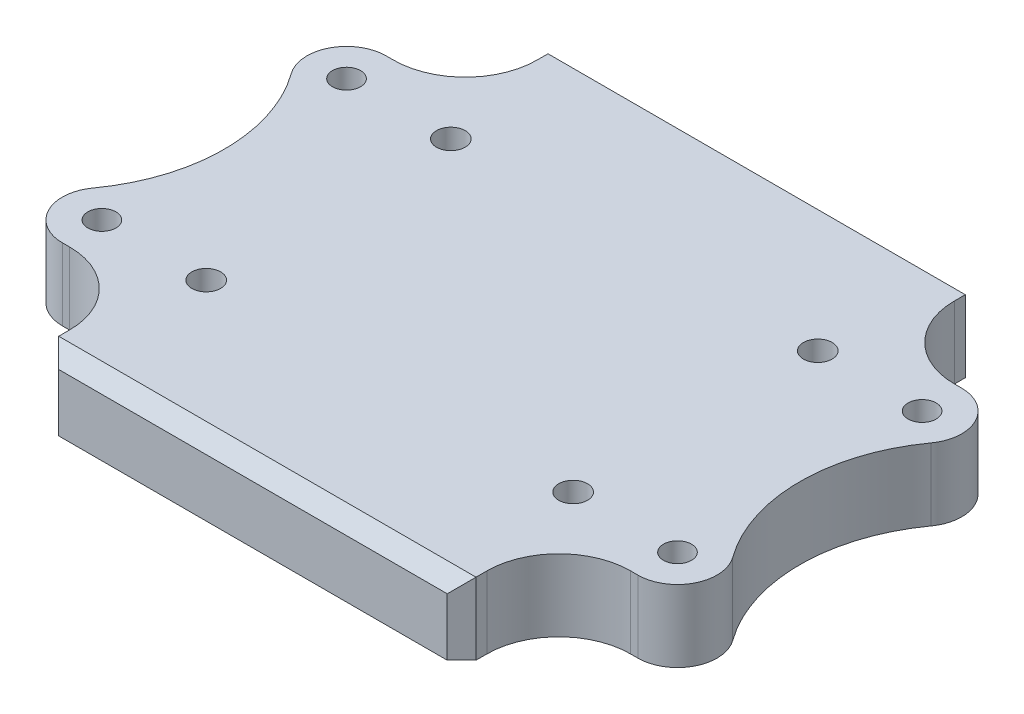
ISO-10303-21;
HEADER;
FILE_DESCRIPTION(('STEP AP214'),'2;1');
FILE_NAME('part.step','',(''),(''),'','','');
FILE_SCHEMA(('AUTOMOTIVE_DESIGN { 1 0 10303 214 1 1 1 1 }'));
ENDSEC;
DATA;
#1=APPLICATION_CONTEXT('core data for automotive mechanical design processes');
#2=APPLICATION_PROTOCOL_DEFINITION('international standard','automotive_design',2000,#1);
#3=PRODUCT_CONTEXT('',#1,'mechanical');
#4=PRODUCT('Part','Part','',(#3));
#5=PRODUCT_RELATED_PRODUCT_CATEGORY('part','',(#4));
#6=PRODUCT_DEFINITION_FORMATION('','',#4);
#7=PRODUCT_DEFINITION_CONTEXT('part definition',#1,'design');
#8=PRODUCT_DEFINITION('design','',#6,#7);
#9=PRODUCT_DEFINITION_SHAPE('','',#8);
#10=(LENGTH_UNIT() NAMED_UNIT(*) SI_UNIT(.MILLI.,.METRE.));
#11=(NAMED_UNIT(*) PLANE_ANGLE_UNIT() SI_UNIT($,.RADIAN.));
#12=(NAMED_UNIT(*) SI_UNIT($,.STERADIAN.) SOLID_ANGLE_UNIT());
#13=UNCERTAINTY_MEASURE_WITH_UNIT(LENGTH_MEASURE(1.E-05),#10,'distance_accuracy_value','');
#14=(GEOMETRIC_REPRESENTATION_CONTEXT(3) GLOBAL_UNCERTAINTY_ASSIGNED_CONTEXT((#13)) GLOBAL_UNIT_ASSIGNED_CONTEXT((#10,
#11,#12)) REPRESENTATION_CONTEXT('',''));
#15=CARTESIAN_POINT('',(0.,0.,0.));
#16=DIRECTION('',(0.,0.,1.));
#17=DIRECTION('',(1.,0.,0.));
#18=AXIS2_PLACEMENT_3D('',#15,#16,#17);
#19=CARTESIAN_POINT('',(40.,0.,22.5));
#20=DIRECTION('',(0.,0.,1.));
#21=DIRECTION('',(1.,0.,0.));
#22=AXIS2_PLACEMENT_3D('',#19,#20,#21);
#23=PLANE('',#22);
#24=DIRECTION('',(-1.,0.,0.));
#25=VECTOR('',#24,1.);
#26=CARTESIAN_POINT('',(40.,0.,22.5));
#27=LINE('',#26,#25);
#28=CARTESIAN_POINT('',(40.,0.,22.5));
#29=VERTEX_POINT('',#28);
#30=CARTESIAN_POINT('',(39.,0.,22.5));
#31=VERTEX_POINT('',#30);
#32=EDGE_CURVE('E259',#29,#31,#27,.T.);
#33=ORIENTED_EDGE('',*,*,#32,.T.);
#34=DIRECTION('',(0.,1.,0.));
#35=VECTOR('',#34,1.);
#36=CARTESIAN_POINT('',(39.,0.,22.5));
#37=LINE('',#36,#35);
#38=CARTESIAN_POINT('',(39.,-10.,22.5));
#39=VERTEX_POINT('',#38);
#40=EDGE_CURVE('E426',#31,#39,#37,.F.);
#41=ORIENTED_EDGE('',*,*,#40,.T.);
#42=DIRECTION('',(-1.,0.,0.));
#43=VECTOR('',#42,1.);
#44=CARTESIAN_POINT('',(40.,-10.,22.5));
#45=LINE('',#44,#43);
#46=CARTESIAN_POINT('',(40.,-10.,22.5));
#47=VERTEX_POINT('',#46);
#48=EDGE_CURVE('E288',#47,#39,#45,.T.);
#49=ORIENTED_EDGE('',*,*,#48,.F.);
#50=DIRECTION('',(0.,-1.,0.));
#51=VECTOR('',#50,1.);
#52=CARTESIAN_POINT('',(40.,0.,22.5));
#53=LINE('',#52,#51);
#54=EDGE_CURVE('E305',#29,#47,#53,.T.);
#55=ORIENTED_EDGE('',*,*,#54,.F.);
#56=EDGE_LOOP('',(#33,#41,#49,#55));
#57=FACE_BOUND('',#56,.T.);
#58=ADVANCED_FACE('F45',(#57),#23,.T.);
#59=CARTESIAN_POINT('',(-39.,-10.,22.5));
#60=VERTEX_POINT('',#59);
#61=CARTESIAN_POINT('',(-40.,-10.,22.5));
#62=VERTEX_POINT('',#61);
#63=EDGE_CURVE('E287',#60,#62,#45,.T.);
#64=ORIENTED_EDGE('',*,*,#63,.F.);
#65=DIRECTION('',(0.,-1.,0.));
#66=VECTOR('',#65,1.);
#67=CARTESIAN_POINT('',(-39.,0.,22.5));
#68=LINE('',#67,#66);
#69=CARTESIAN_POINT('',(-39.,0.,22.5));
#70=VERTEX_POINT('',#69);
#71=EDGE_CURVE('E61',#60,#70,#68,.F.);
#72=ORIENTED_EDGE('',*,*,#71,.T.);
#73=CARTESIAN_POINT('',(-40.,0.,22.5));
#74=VERTEX_POINT('',#73);
#75=EDGE_CURVE('E258',#70,#74,#27,.T.);
#76=ORIENTED_EDGE('',*,*,#75,.T.);
#77=DIRECTION('',(0.,-1.,0.));
#78=VECTOR('',#77,1.);
#79=CARTESIAN_POINT('',(-40.,0.,22.5));
#80=LINE('',#79,#78);
#81=EDGE_CURVE('E301',#74,#62,#80,.T.);
#82=ORIENTED_EDGE('',*,*,#81,.T.);
#83=EDGE_LOOP('',(#64,#72,#76,#82));
#84=FACE_BOUND('',#83,.T.);
#85=ADVANCED_FACE('F461',(#84),#23,.T.);
#86=CARTESIAN_POINT('',(-40.,0.,-22.5));
#87=DIRECTION('',(0.,0.,-1.));
#88=DIRECTION('',(-1.,0.,0.));
#89=AXIS2_PLACEMENT_3D('',#86,#87,#88);
#90=PLANE('',#89);
#91=DIRECTION('',(1.,0.,0.));
#92=VECTOR('',#91,1.);
#93=CARTESIAN_POINT('',(-40.,0.,-22.5));
#94=LINE('',#93,#92);
#95=CARTESIAN_POINT('',(-40.,0.,-22.5));
#96=VERTEX_POINT('',#95);
#97=CARTESIAN_POINT('',(-39.,0.,-22.5));
#98=VERTEX_POINT('',#97);
#99=EDGE_CURVE('E208',#96,#98,#94,.T.);
#100=ORIENTED_EDGE('',*,*,#99,.T.);
#101=DIRECTION('',(0.,1.,0.));
#102=VECTOR('',#101,1.);
#103=CARTESIAN_POINT('',(-39.,0.,-22.5));
#104=LINE('',#103,#102);
#105=CARTESIAN_POINT('',(-39.,-10.,-22.5));
#106=VERTEX_POINT('',#105);
#107=EDGE_CURVE('E419',#98,#106,#104,.F.);
#108=ORIENTED_EDGE('',*,*,#107,.T.);
#109=DIRECTION('',(1.,0.,0.));
#110=VECTOR('',#109,1.);
#111=CARTESIAN_POINT('',(-40.,-10.,-22.5));
#112=LINE('',#111,#110);
#113=CARTESIAN_POINT('',(-40.,-10.,-22.5));
#114=VERTEX_POINT('',#113);
#115=EDGE_CURVE('E211',#114,#106,#112,.T.);
#116=ORIENTED_EDGE('',*,*,#115,.F.);
#117=DIRECTION('',(0.,-1.,0.));
#118=VECTOR('',#117,1.);
#119=CARTESIAN_POINT('',(-40.,0.,-22.5));
#120=LINE('',#119,#118);
#121=EDGE_CURVE('E205',#96,#114,#120,.T.);
#122=ORIENTED_EDGE('',*,*,#121,.F.);
#123=EDGE_LOOP('',(#100,#108,#116,#122));
#124=FACE_BOUND('',#123,.T.);
#125=ADVANCED_FACE('F207',(#124),#90,.T.);
#126=CARTESIAN_POINT('',(39.,-10.,-22.5));
#127=VERTEX_POINT('',#126);
#128=CARTESIAN_POINT('',(40.,-10.,-22.5));
#129=VERTEX_POINT('',#128);
#130=EDGE_CURVE('E272',#127,#129,#112,.T.);
#131=ORIENTED_EDGE('',*,*,#130,.F.);
#132=DIRECTION('',(0.,-1.,0.));
#133=VECTOR('',#132,1.);
#134=CARTESIAN_POINT('',(39.,0.,-22.5));
#135=LINE('',#134,#133);
#136=CARTESIAN_POINT('',(39.,0.,-22.5));
#137=VERTEX_POINT('',#136);
#138=EDGE_CURVE('E433',#127,#137,#135,.F.);
#139=ORIENTED_EDGE('',*,*,#138,.T.);
#140=CARTESIAN_POINT('',(40.,0.,-22.5));
#141=VERTEX_POINT('',#140);
#142=EDGE_CURVE('E231',#137,#141,#94,.T.);
#143=ORIENTED_EDGE('',*,*,#142,.T.);
#144=DIRECTION('',(0.,-1.,0.));
#145=VECTOR('',#144,1.);
#146=CARTESIAN_POINT('',(40.,0.,-22.5));
#147=LINE('',#146,#145);
#148=EDGE_CURVE('E217',#141,#129,#147,.T.);
#149=ORIENTED_EDGE('',*,*,#148,.T.);
#150=EDGE_LOOP('',(#131,#139,#143,#149));
#151=FACE_BOUND('',#150,.T.);
#152=ADVANCED_FACE('F599',(#151),#90,.T.);
#153=CARTESIAN_POINT('',(-40.,0.,-17.));
#154=DIRECTION('',(0.,-1.,0.));
#155=DIRECTION('',(0.,0.,-1.));
#156=AXIS2_PLACEMENT_3D('',#153,#154,#155);
#157=CYLINDRICAL_SURFACE('',#156,5.5);
#158=CARTESIAN_POINT('',(-40.,-10.,-17.));
#159=DIRECTION('',(0.,-1.,0.));
#160=DIRECTION('',(0.,0.,-1.));
#161=AXIS2_PLACEMENT_3D('',#158,#159,#160);
#162=CIRCLE('',#161,5.5);
#163=CARTESIAN_POINT('',(-44.4577133907596,-10.,-13.778386844166));
#164=VERTEX_POINT('',#163);
#165=EDGE_CURVE('E269',#164,#114,#162,.T.);
#166=ORIENTED_EDGE('',*,*,#165,.F.);
#167=DIRECTION('',(0.,-1.,0.));
#168=VECTOR('',#167,1.);
#169=CARTESIAN_POINT('',(-44.4577133907596,0.,-13.778386844166));
#170=LINE('',#169,#168);
#171=CARTESIAN_POINT('',(-44.4577133907596,0.,-13.778386844166));
#172=VERTEX_POINT('',#171);
#173=EDGE_CURVE('E234',#172,#164,#170,.T.);
#174=ORIENTED_EDGE('',*,*,#173,.F.);
#175=CARTESIAN_POINT('',(-40.,0.,-17.));
#176=DIRECTION('',(0.,-1.,0.));
#177=DIRECTION('',(0.,0.,-1.));
#178=AXIS2_PLACEMENT_3D('',#175,#176,#177);
#179=CIRCLE('',#178,5.5);
#180=EDGE_CURVE('E225',#172,#96,#179,.T.);
#181=ORIENTED_EDGE('',*,*,#180,.T.);
#182=ORIENTED_EDGE('',*,*,#121,.T.);
#183=EDGE_LOOP('',(#166,#174,#181,#182));
#184=FACE_BOUND('',#183,.T.);
#185=ADVANCED_FACE('F233',(#184),#157,.T.);
#186=CARTESIAN_POINT('',(-63.5227272727273,0.,0.));
#187=DIRECTION('',(0.,-1.,0.));
#188=DIRECTION('',(0.,0.,-1.));
#189=AXIS2_PLACEMENT_3D('',#186,#187,#188);
#190=CYLINDRICAL_SURFACE('',#189,23.5227272727273);
#191=CARTESIAN_POINT('',(-63.5227272727273,-10.,0.));
#192=DIRECTION('',(0.,1.,0.));
#193=DIRECTION('',(0.,0.,1.));
#194=AXIS2_PLACEMENT_3D('',#191,#192,#193);
#195=CIRCLE('',#194,23.5227272727273);
#196=CARTESIAN_POINT('',(-44.4577133907596,-10.,13.778386844166));
#197=VERTEX_POINT('',#196);
#198=EDGE_CURVE('E236',#197,#164,#195,.T.);
#199=ORIENTED_EDGE('',*,*,#198,.F.);
#200=DIRECTION('',(0.,-1.,0.));
#201=VECTOR('',#200,1.);
#202=CARTESIAN_POINT('',(-44.4577133907596,0.,13.778386844166));
#203=LINE('',#202,#201);
#204=CARTESIAN_POINT('',(-44.4577133907596,0.,13.778386844166));
#205=VERTEX_POINT('',#204);
#206=EDGE_CURVE('E298',#205,#197,#203,.T.);
#207=ORIENTED_EDGE('',*,*,#206,.F.);
#208=CARTESIAN_POINT('',(-63.5227272727273,0.,0.));
#209=DIRECTION('',(0.,1.,0.));
#210=DIRECTION('',(0.,0.,1.));
#211=AXIS2_PLACEMENT_3D('',#208,#209,#210);
#212=CIRCLE('',#211,23.5227272727273);
#213=EDGE_CURVE('E218',#205,#172,#212,.T.);
#214=ORIENTED_EDGE('',*,*,#213,.T.);
#215=ORIENTED_EDGE('',*,*,#173,.T.);
#216=EDGE_LOOP('',(#199,#207,#214,#215));
#217=FACE_BOUND('',#216,.T.);
#218=ADVANCED_FACE('F469',(#217),#190,.F.);
#219=CARTESIAN_POINT('',(-40.,0.,17.));
#220=DIRECTION('',(0.,-1.,0.));
#221=DIRECTION('',(0.,0.,-1.));
#222=AXIS2_PLACEMENT_3D('',#219,#220,#221);
#223=CYLINDRICAL_SURFACE('',#222,5.5);
#224=CARTESIAN_POINT('',(-40.,-10.,17.));
#225=DIRECTION('',(0.,-1.,0.));
#226=DIRECTION('',(0.,0.,-1.));
#227=AXIS2_PLACEMENT_3D('',#224,#225,#226);
#228=CIRCLE('',#227,5.5);
#229=EDGE_CURVE('E241',#62,#197,#228,.T.);
#230=ORIENTED_EDGE('',*,*,#229,.F.);
#231=ORIENTED_EDGE('',*,*,#81,.F.);
#232=CARTESIAN_POINT('',(-40.,0.,17.));
#233=DIRECTION('',(0.,-1.,0.));
#234=DIRECTION('',(0.,0.,-1.));
#235=AXIS2_PLACEMENT_3D('',#232,#233,#234);
#236=CIRCLE('',#235,5.5);
#237=EDGE_CURVE('E263',#74,#205,#236,.T.);
#238=ORIENTED_EDGE('',*,*,#237,.T.);
#239=ORIENTED_EDGE('',*,*,#206,.T.);
#240=EDGE_LOOP('',(#230,#231,#238,#239));
#241=FACE_BOUND('',#240,.T.);
#242=ADVANCED_FACE('F466',(#241),#223,.T.);
#243=CARTESIAN_POINT('',(40.,0.,17.));
#244=DIRECTION('',(0.,-1.,0.));
#245=DIRECTION('',(0.,0.,-1.));
#246=AXIS2_PLACEMENT_3D('',#243,#244,#245);
#247=CYLINDRICAL_SURFACE('',#246,5.5);
#248=CARTESIAN_POINT('',(40.,-10.,17.));
#249=DIRECTION('',(0.,-1.,0.));
#250=DIRECTION('',(0.,0.,-1.));
#251=AXIS2_PLACEMENT_3D('',#248,#249,#250);
#252=CIRCLE('',#251,5.5);
#253=CARTESIAN_POINT('',(44.4577133907596,-10.,13.778386844166));
#254=VERTEX_POINT('',#253);
#255=EDGE_CURVE('E283',#254,#47,#252,.T.);
#256=ORIENTED_EDGE('',*,*,#255,.F.);
#257=DIRECTION('',(0.,-1.,0.));
#258=VECTOR('',#257,1.);
#259=CARTESIAN_POINT('',(44.4577133907596,0.,13.778386844166));
#260=LINE('',#259,#258);
#261=CARTESIAN_POINT('',(44.4577133907596,0.,13.778386844166));
#262=VERTEX_POINT('',#261);
#263=EDGE_CURVE('E308',#262,#254,#260,.T.);
#264=ORIENTED_EDGE('',*,*,#263,.F.);
#265=CARTESIAN_POINT('',(40.,0.,17.));
#266=DIRECTION('',(0.,-1.,0.));
#267=DIRECTION('',(0.,0.,-1.));
#268=AXIS2_PLACEMENT_3D('',#265,#266,#267);
#269=CIRCLE('',#268,5.5);
#270=EDGE_CURVE('E254',#262,#29,#269,.T.);
#271=ORIENTED_EDGE('',*,*,#270,.T.);
#272=ORIENTED_EDGE('',*,*,#54,.T.);
#273=EDGE_LOOP('',(#256,#264,#271,#272));
#274=FACE_BOUND('',#273,.T.);
#275=ADVANCED_FACE('F585',(#274),#247,.T.);
#276=CARTESIAN_POINT('',(63.5227272727273,0.,0.));
#277=DIRECTION('',(0.,-1.,0.));
#278=DIRECTION('',(0.,0.,-1.));
#279=AXIS2_PLACEMENT_3D('',#276,#277,#278);
#280=CYLINDRICAL_SURFACE('',#279,23.5227272727273);
#281=CARTESIAN_POINT('',(63.5227272727273,-10.,0.));
#282=DIRECTION('',(0.,1.,0.));
#283=DIRECTION('',(0.,0.,1.));
#284=AXIS2_PLACEMENT_3D('',#281,#282,#283);
#285=CIRCLE('',#284,23.5227272727273);
#286=CARTESIAN_POINT('',(44.4577133907596,-10.,-13.778386844166));
#287=VERTEX_POINT('',#286);
#288=EDGE_CURVE('E279',#287,#254,#285,.T.);
#289=ORIENTED_EDGE('',*,*,#288,.F.);
#290=DIRECTION('',(0.,-1.,0.));
#291=VECTOR('',#290,1.);
#292=CARTESIAN_POINT('',(44.4577133907596,0.,-13.778386844166));
#293=LINE('',#292,#291);
#294=CARTESIAN_POINT('',(44.4577133907596,0.,-13.778386844166));
#295=VERTEX_POINT('',#294);
#296=EDGE_CURVE('E311',#295,#287,#293,.T.);
#297=ORIENTED_EDGE('',*,*,#296,.F.);
#298=CARTESIAN_POINT('',(63.5227272727273,0.,0.));
#299=DIRECTION('',(0.,1.,0.));
#300=DIRECTION('',(0.,0.,1.));
#301=AXIS2_PLACEMENT_3D('',#298,#299,#300);
#302=CIRCLE('',#301,23.5227272727273);
#303=EDGE_CURVE('E250',#295,#262,#302,.T.);
#304=ORIENTED_EDGE('',*,*,#303,.T.);
#305=ORIENTED_EDGE('',*,*,#263,.T.);
#306=EDGE_LOOP('',(#289,#297,#304,#305));
#307=FACE_BOUND('',#306,.T.);
#308=ADVANCED_FACE('F588',(#307),#280,.F.);
#309=CARTESIAN_POINT('',(40.,0.,-17.));
#310=DIRECTION('',(0.,-1.,0.));
#311=DIRECTION('',(0.,0.,-1.));
#312=AXIS2_PLACEMENT_3D('',#309,#310,#311);
#313=CYLINDRICAL_SURFACE('',#312,5.50000000000001);
#314=CARTESIAN_POINT('',(40.,-10.,-17.));
#315=DIRECTION('',(0.,-1.,0.));
#316=DIRECTION('',(0.,0.,-1.));
#317=AXIS2_PLACEMENT_3D('',#314,#315,#316);
#318=CIRCLE('',#317,5.50000000000001);
#319=EDGE_CURVE('E275',#129,#287,#318,.T.);
#320=ORIENTED_EDGE('',*,*,#319,.F.);
#321=ORIENTED_EDGE('',*,*,#148,.F.);
#322=CARTESIAN_POINT('',(40.,0.,-17.));
#323=DIRECTION('',(0.,-1.,0.));
#324=DIRECTION('',(0.,0.,-1.));
#325=AXIS2_PLACEMENT_3D('',#322,#323,#324);
#326=CIRCLE('',#325,5.50000000000001);
#327=EDGE_CURVE('E230',#141,#295,#326,.T.);
#328=ORIENTED_EDGE('',*,*,#327,.T.);
#329=ORIENTED_EDGE('',*,*,#296,.T.);
#330=EDGE_LOOP('',(#320,#321,#328,#329));
#331=FACE_BOUND('',#330,.T.);
#332=ADVANCED_FACE('F592',(#331),#313,.T.);
#333=CARTESIAN_POINT('',(-40.,0.,-17.));
#334=DIRECTION('',(0.,-1.,0.));
#335=DIRECTION('',(0.,0.,-1.));
#336=AXIS2_PLACEMENT_3D('',#333,#334,#335);
#337=PLANE('',#336);
#338=CARTESIAN_POINT('',(-40.,0.,-17.));
#339=DIRECTION('',(0.,-1.,0.));
#340=DIRECTION('',(0.,0.,-1.));
#341=AXIS2_PLACEMENT_3D('',#338,#339,#340);
#342=CIRCLE('',#341,1.94999999999999);
#343=CARTESIAN_POINT('',(-40.,0.,-18.95));
#344=VERTEX_POINT('',#343);
#345=EDGE_CURVE('E408',#344,#344,#342,.T.);
#346=ORIENTED_EDGE('',*,*,#345,.T.);
#347=EDGE_LOOP('',(#346));
#348=FACE_BOUND('',#347,.T.);
#349=CARTESIAN_POINT('',(40.,0.,-17.));
#350=DIRECTION('',(0.,-1.,0.));
#351=DIRECTION('',(0.,0.,-1.));
#352=AXIS2_PLACEMENT_3D('',#349,#350,#351);
#353=CIRCLE('',#352,1.94999999999999);
#354=CARTESIAN_POINT('',(40.,0.,-18.95));
#355=VERTEX_POINT('',#354);
#356=EDGE_CURVE('E549',#355,#355,#353,.T.);
#357=ORIENTED_EDGE('',*,*,#356,.T.);
#358=EDGE_LOOP('',(#357));
#359=FACE_BOUND('',#358,.T.);
#360=CARTESIAN_POINT('',(40.,0.,17.));
#361=DIRECTION('',(0.,-1.,0.));
#362=DIRECTION('',(0.,0.,-1.));
#363=AXIS2_PLACEMENT_3D('',#360,#361,#362);
#364=CIRCLE('',#363,1.94999999999999);
#365=CARTESIAN_POINT('',(40.,0.,15.05));
#366=VERTEX_POINT('',#365);
#367=EDGE_CURVE('E545',#366,#366,#364,.T.);
#368=ORIENTED_EDGE('',*,*,#367,.T.);
#369=EDGE_LOOP('',(#368));
#370=FACE_BOUND('',#369,.T.);
#371=CARTESIAN_POINT('',(-40.,0.,17.));
#372=DIRECTION('',(0.,-1.,0.));
#373=DIRECTION('',(0.,0.,-1.));
#374=AXIS2_PLACEMENT_3D('',#371,#372,#373);
#375=CIRCLE('',#374,1.94999999999999);
#376=CARTESIAN_POINT('',(-40.,0.,15.05));
#377=VERTEX_POINT('',#376);
#378=EDGE_CURVE('E541',#377,#377,#375,.T.);
#379=ORIENTED_EDGE('',*,*,#378,.T.);
#380=EDGE_LOOP('',(#379));
#381=FACE_BOUND('',#380,.T.);
#382=CARTESIAN_POINT('',(-25.5,0.,17.));
#383=DIRECTION('',(0.,1.,0.));
#384=DIRECTION('',(0.,0.,1.));
#385=AXIS2_PLACEMENT_3D('',#382,#383,#384);
#386=CIRCLE('',#385,1.99999999999999);
#387=CARTESIAN_POINT('',(-25.5,0.,19.));
#388=VERTEX_POINT('',#387);
#389=EDGE_CURVE('E537',#388,#388,#386,.T.);
#390=ORIENTED_EDGE('',*,*,#389,.F.);
#391=EDGE_LOOP('',(#390));
#392=FACE_BOUND('',#391,.T.);
#393=CARTESIAN_POINT('',(-25.5,0.,-17.));
#394=DIRECTION('',(0.,1.,0.));
#395=DIRECTION('',(0.,0.,1.));
#396=AXIS2_PLACEMENT_3D('',#393,#394,#395);
#397=CIRCLE('',#396,1.99999999999999);
#398=CARTESIAN_POINT('',(-25.5,0.,-15.));
#399=VERTEX_POINT('',#398);
#400=EDGE_CURVE('E529',#399,#399,#397,.T.);
#401=ORIENTED_EDGE('',*,*,#400,.F.);
#402=EDGE_LOOP('',(#401));
#403=FACE_BOUND('',#402,.T.);
#404=CARTESIAN_POINT('',(25.5,0.,-17.));
#405=DIRECTION('',(0.,1.,0.));
#406=DIRECTION('',(0.,0.,1.));
#407=AXIS2_PLACEMENT_3D('',#404,#405,#406);
#408=CIRCLE('',#407,1.99999999999999);
#409=CARTESIAN_POINT('',(25.5,0.,-15.));
#410=VERTEX_POINT('',#409);
#411=EDGE_CURVE('E521',#410,#410,#408,.T.);
#412=ORIENTED_EDGE('',*,*,#411,.F.);
#413=EDGE_LOOP('',(#412));
#414=FACE_BOUND('',#413,.T.);
#415=CARTESIAN_POINT('',(25.5,0.,17.));
#416=DIRECTION('',(0.,1.,0.));
#417=DIRECTION('',(0.,0.,1.));
#418=AXIS2_PLACEMENT_3D('',#415,#416,#417);
#419=CIRCLE('',#418,1.99999999999999);
#420=CARTESIAN_POINT('',(25.5,0.,19.));
#421=VERTEX_POINT('',#420);
#422=EDGE_CURVE('E513',#421,#421,#419,.T.);
#423=ORIENTED_EDGE('',*,*,#422,.F.);
#424=EDGE_LOOP('',(#423));
#425=FACE_BOUND('',#424,.T.);
#426=DIRECTION('',(0.,0.,-1.));
#427=VECTOR('',#426,1.);
#428=CARTESIAN_POINT('',(-29.,0.,36.));
#429=LINE('',#428,#427);
#430=CARTESIAN_POINT('',(-29.,0.,34.));
#431=VERTEX_POINT('',#430);
#432=CARTESIAN_POINT('',(-29.,0.,32.5));
#433=VERTEX_POINT('',#432);
#434=EDGE_CURVE('E494',#431,#433,#429,.T.);
#435=ORIENTED_EDGE('',*,*,#434,.F.);
#436=DIRECTION('',(1.,0.,0.));
#437=VECTOR('',#436,1.);
#438=CARTESIAN_POINT('',(-40.,0.,34.));
#439=LINE('',#438,#437);
#440=CARTESIAN_POINT('',(29.,0.,34.));
#441=VERTEX_POINT('',#440);
#442=EDGE_CURVE('E379',#431,#441,#439,.T.);
#443=ORIENTED_EDGE('',*,*,#442,.T.);
#444=DIRECTION('',(0.,0.,-1.));
#445=VECTOR('',#444,1.);
#446=CARTESIAN_POINT('',(29.,0.,36.));
#447=LINE('',#446,#445);
#448=CARTESIAN_POINT('',(29.,0.,32.5));
#449=VERTEX_POINT('',#448);
#450=EDGE_CURVE('E490',#441,#449,#447,.T.);
#451=ORIENTED_EDGE('',*,*,#450,.T.);
#452=CARTESIAN_POINT('',(39.,0.,32.5));
#453=DIRECTION('',(0.,-1.,0.));
#454=DIRECTION('',(0.,0.,-1.));
#455=AXIS2_PLACEMENT_3D('',#452,#453,#454);
#456=CIRCLE('',#455,10.);
#457=EDGE_CURVE('E447',#449,#31,#456,.T.);
#458=ORIENTED_EDGE('',*,*,#457,.T.);
#459=ORIENTED_EDGE('',*,*,#32,.F.);
#460=ORIENTED_EDGE('',*,*,#270,.F.);
#461=ORIENTED_EDGE('',*,*,#303,.F.);
#462=ORIENTED_EDGE('',*,*,#327,.F.);
#463=ORIENTED_EDGE('',*,*,#142,.F.);
#464=CARTESIAN_POINT('',(39.,0.,-32.5));
#465=DIRECTION('',(0.,-1.,0.));
#466=DIRECTION('',(0.,0.,-1.));
#467=AXIS2_PLACEMENT_3D('',#464,#465,#466);
#468=CIRCLE('',#467,10.);
#469=CARTESIAN_POINT('',(29.,0.,-32.5));
#470=VERTEX_POINT('',#469);
#471=EDGE_CURVE('E456',#137,#470,#468,.T.);
#472=ORIENTED_EDGE('',*,*,#471,.T.);
#473=DIRECTION('',(0.,0.,1.));
#474=VECTOR('',#473,1.);
#475=CARTESIAN_POINT('',(29.,0.,-36.));
#476=LINE('',#475,#474);
#477=CARTESIAN_POINT('',(29.,0.,-34.));
#478=VERTEX_POINT('',#477);
#479=EDGE_CURVE('E479',#478,#470,#476,.T.);
#480=ORIENTED_EDGE('',*,*,#479,.F.);
#481=DIRECTION('',(-1.,0.,0.));
#482=VECTOR('',#481,1.);
#483=CARTESIAN_POINT('',(-40.,0.,-34.));
#484=LINE('',#483,#482);
#485=CARTESIAN_POINT('',(-29.,0.,-34.));
#486=VERTEX_POINT('',#485);
#487=EDGE_CURVE('E376',#478,#486,#484,.T.);
#488=ORIENTED_EDGE('',*,*,#487,.T.);
#489=DIRECTION('',(0.,0.,1.));
#490=VECTOR('',#489,1.);
#491=CARTESIAN_POINT('',(-29.,0.,-36.));
#492=LINE('',#491,#490);
#493=CARTESIAN_POINT('',(-29.,0.,-32.5));
#494=VERTEX_POINT('',#493);
#495=EDGE_CURVE('E477',#486,#494,#492,.T.);
#496=ORIENTED_EDGE('',*,*,#495,.T.);
#497=CARTESIAN_POINT('',(-39.,0.,-32.5));
#498=DIRECTION('',(0.,-1.,0.));
#499=DIRECTION('',(0.,0.,-1.));
#500=AXIS2_PLACEMENT_3D('',#497,#498,#499);
#501=CIRCLE('',#500,10.);
#502=EDGE_CURVE('E228',#494,#98,#501,.T.);
#503=ORIENTED_EDGE('',*,*,#502,.T.);
#504=ORIENTED_EDGE('',*,*,#99,.F.);
#505=ORIENTED_EDGE('',*,*,#180,.F.);
#506=ORIENTED_EDGE('',*,*,#213,.F.);
#507=ORIENTED_EDGE('',*,*,#237,.F.);
#508=ORIENTED_EDGE('',*,*,#75,.F.);
#509=CARTESIAN_POINT('',(-39.,0.,32.5));
#510=DIRECTION('',(0.,-1.,0.));
#511=DIRECTION('',(0.,0.,-1.));
#512=AXIS2_PLACEMENT_3D('',#509,#510,#511);
#513=CIRCLE('',#512,10.);
#514=EDGE_CURVE('E11',#70,#433,#513,.T.);
#515=ORIENTED_EDGE('',*,*,#514,.T.);
#516=EDGE_LOOP('',(#435,#443,#451,#458,#459,#460,#461,#462,#463,#472,#480,#488,#496,#503,#504,
#505,#506,#507,#508,#515));
#517=FACE_BOUND('',#516,.T.);
#518=ADVANCED_FACE('F223',(#348,#359,#370,#381,#392,#403,#414,#425,#517),#337,.F.);
#519=CARTESIAN_POINT('',(-40.,-10.,-17.));
#520=DIRECTION('',(0.,-1.,0.));
#521=DIRECTION('',(0.,0.,-1.));
#522=AXIS2_PLACEMENT_3D('',#519,#520,#521);
#523=PLANE('',#522);
#524=CARTESIAN_POINT('',(40.,-10.,17.));
#525=DIRECTION('',(0.,-1.,0.));
#526=DIRECTION('',(0.,0.,-1.));
#527=AXIS2_PLACEMENT_3D('',#524,#525,#526);
#528=CIRCLE('',#527,3.44999999999999);
#529=CARTESIAN_POINT('',(40.,-10.,13.55));
#530=VERTEX_POINT('',#529);
#531=EDGE_CURVE('E332',#530,#530,#528,.F.);
#532=ORIENTED_EDGE('',*,*,#531,.T.);
#533=EDGE_LOOP('',(#532));
#534=FACE_BOUND('',#533,.T.);
#535=CARTESIAN_POINT('',(-40.,-10.,-17.));
#536=DIRECTION('',(0.,-1.,0.));
#537=DIRECTION('',(0.,0.,-1.));
#538=AXIS2_PLACEMENT_3D('',#535,#536,#537);
#539=CIRCLE('',#538,3.44999999999999);
#540=CARTESIAN_POINT('',(-40.,-10.,-20.45));
#541=VERTEX_POINT('',#540);
#542=EDGE_CURVE('E328',#541,#541,#539,.F.);
#543=ORIENTED_EDGE('',*,*,#542,.T.);
#544=EDGE_LOOP('',(#543));
#545=FACE_BOUND('',#544,.T.);
#546=CARTESIAN_POINT('',(40.,-10.,-17.));
#547=DIRECTION('',(0.,-1.,0.));
#548=DIRECTION('',(0.,0.,-1.));
#549=AXIS2_PLACEMENT_3D('',#546,#547,#548);
#550=CIRCLE('',#549,3.44999999999999);
#551=CARTESIAN_POINT('',(40.,-10.,-20.45));
#552=VERTEX_POINT('',#551);
#553=EDGE_CURVE('E324',#552,#552,#550,.F.);
#554=ORIENTED_EDGE('',*,*,#553,.T.);
#555=EDGE_LOOP('',(#554));
#556=FACE_BOUND('',#555,.T.);
#557=CARTESIAN_POINT('',(-40.,-10.,17.));
#558=DIRECTION('',(0.,-1.,0.));
#559=DIRECTION('',(0.,0.,-1.));
#560=AXIS2_PLACEMENT_3D('',#557,#558,#559);
#561=CIRCLE('',#560,3.44999999999999);
#562=CARTESIAN_POINT('',(-40.,-10.,13.55));
#563=VERTEX_POINT('',#562);
#564=EDGE_CURVE('E320',#563,#563,#561,.F.);
#565=ORIENTED_EDGE('',*,*,#564,.T.);
#566=EDGE_LOOP('',(#565));
#567=FACE_BOUND('',#566,.T.);
#568=CARTESIAN_POINT('',(-25.5,-9.99999999999999,17.));
#569=DIRECTION('',(0.,1.,0.));
#570=DIRECTION('',(0.,0.,1.));
#571=AXIS2_PLACEMENT_3D('',#568,#569,#570);
#572=CIRCLE('',#571,1.99999999999999);
#573=CARTESIAN_POINT('',(-25.5,-9.99999999999999,19.));
#574=VERTEX_POINT('',#573);
#575=EDGE_CURVE('E533',#574,#574,#572,.T.);
#576=ORIENTED_EDGE('',*,*,#575,.T.);
#577=EDGE_LOOP('',(#576));
#578=FACE_BOUND('',#577,.T.);
#579=CARTESIAN_POINT('',(-25.5,-9.99999999999999,-17.));
#580=DIRECTION('',(0.,1.,0.));
#581=DIRECTION('',(0.,0.,1.));
#582=AXIS2_PLACEMENT_3D('',#579,#580,#581);
#583=CIRCLE('',#582,1.99999999999999);
#584=CARTESIAN_POINT('',(-25.5,-9.99999999999999,-15.));
#585=VERTEX_POINT('',#584);
#586=EDGE_CURVE('E525',#585,#585,#583,.T.);
#587=ORIENTED_EDGE('',*,*,#586,.T.);
#588=EDGE_LOOP('',(#587));
#589=FACE_BOUND('',#588,.T.);
#590=CARTESIAN_POINT('',(25.5,-9.99999999999999,-17.));
#591=DIRECTION('',(0.,1.,0.));
#592=DIRECTION('',(0.,0.,1.));
#593=AXIS2_PLACEMENT_3D('',#590,#591,#592);
#594=CIRCLE('',#593,1.99999999999999);
#595=CARTESIAN_POINT('',(25.5,-9.99999999999999,-15.));
#596=VERTEX_POINT('',#595);
#597=EDGE_CURVE('E517',#596,#596,#594,.T.);
#598=ORIENTED_EDGE('',*,*,#597,.T.);
#599=EDGE_LOOP('',(#598));
#600=FACE_BOUND('',#599,.T.);
#601=CARTESIAN_POINT('',(25.5,-9.99999999999999,17.));
#602=DIRECTION('',(0.,1.,0.));
#603=DIRECTION('',(0.,0.,1.));
#604=AXIS2_PLACEMENT_3D('',#601,#602,#603);
#605=CIRCLE('',#604,1.99999999999999);
#606=CARTESIAN_POINT('',(25.5,-9.99999999999999,19.));
#607=VERTEX_POINT('',#606);
#608=EDGE_CURVE('E509',#607,#607,#605,.T.);
#609=ORIENTED_EDGE('',*,*,#608,.T.);
#610=EDGE_LOOP('',(#609));
#611=FACE_BOUND('',#610,.T.);
#612=DIRECTION('',(1.,0.,0.));
#613=VECTOR('',#612,1.);
#614=CARTESIAN_POINT('',(29.,-10.,36.));
#615=LINE('',#614,#613);
#616=CARTESIAN_POINT('',(-27.,-10.,36.));
#617=VERTEX_POINT('',#616);
#618=CARTESIAN_POINT('',(27.,-10.,36.));
#619=VERTEX_POINT('',#618);
#620=EDGE_CURVE('E505',#617,#619,#615,.T.);
#621=ORIENTED_EDGE('',*,*,#620,.F.);
#622=DIRECTION('',(0.707106781186545,0.,0.70710678118655));
#623=VECTOR('',#622,1.);
#624=CARTESIAN_POINT('',(-59.9999999999999,-10.,2.99999999999981));
#625=LINE('',#624,#623);
#626=CARTESIAN_POINT('',(-29.,-10.,34.));
#627=VERTEX_POINT('',#626);
#628=EDGE_CURVE('E367',#617,#627,#625,.F.);
#629=ORIENTED_EDGE('',*,*,#628,.T.);
#630=DIRECTION('',(0.,0.,-1.));
#631=VECTOR('',#630,1.);
#632=CARTESIAN_POINT('',(-29.,-10.,36.));
#633=LINE('',#632,#631);
#634=CARTESIAN_POINT('',(-29.,-10.,32.5));
#635=VERTEX_POINT('',#634);
#636=EDGE_CURVE('E498',#627,#635,#633,.T.);
#637=ORIENTED_EDGE('',*,*,#636,.T.);
#638=CARTESIAN_POINT('',(-39.,-10.,32.5));
#639=DIRECTION('',(0.,-1.,0.));
#640=DIRECTION('',(0.,0.,-1.));
#641=AXIS2_PLACEMENT_3D('',#638,#639,#640);
#642=CIRCLE('',#641,10.);
#643=EDGE_CURVE('E54',#635,#60,#642,.F.);
#644=ORIENTED_EDGE('',*,*,#643,.T.);
#645=ORIENTED_EDGE('',*,*,#63,.T.);
#646=ORIENTED_EDGE('',*,*,#229,.T.);
#647=ORIENTED_EDGE('',*,*,#198,.T.);
#648=ORIENTED_EDGE('',*,*,#165,.T.);
#649=ORIENTED_EDGE('',*,*,#115,.T.);
#650=CARTESIAN_POINT('',(-39.,-10.,-32.5));
#651=DIRECTION('',(0.,-1.,0.));
#652=DIRECTION('',(0.,0.,-1.));
#653=AXIS2_PLACEMENT_3D('',#650,#651,#652);
#654=CIRCLE('',#653,10.);
#655=CARTESIAN_POINT('',(-29.,-10.,-32.5));
#656=VERTEX_POINT('',#655);
#657=EDGE_CURVE('E444',#106,#656,#654,.F.);
#658=ORIENTED_EDGE('',*,*,#657,.T.);
#659=DIRECTION('',(0.,0.,1.));
#660=VECTOR('',#659,1.);
#661=CARTESIAN_POINT('',(-29.,-10.,-36.));
#662=LINE('',#661,#660);
#663=CARTESIAN_POINT('',(-29.,-10.,-34.));
#664=VERTEX_POINT('',#663);
#665=EDGE_CURVE('E244',#664,#656,#662,.T.);
#666=ORIENTED_EDGE('',*,*,#665,.F.);
#667=DIRECTION('',(-0.707106781186545,0.,0.70710678118655));
#668=VECTOR('',#667,1.);
#669=CARTESIAN_POINT('',(-43.,-10.,-19.9999999999999));
#670=LINE('',#669,#668);
#671=CARTESIAN_POINT('',(-27.,-10.,-36.));
#672=VERTEX_POINT('',#671);
#673=EDGE_CURVE('E358',#664,#672,#670,.F.);
#674=ORIENTED_EDGE('',*,*,#673,.T.);
#675=DIRECTION('',(-1.,0.,0.));
#676=VECTOR('',#675,1.);
#677=CARTESIAN_POINT('',(-29.,-10.,-36.));
#678=LINE('',#677,#676);
#679=CARTESIAN_POINT('',(27.,-10.,-36.));
#680=VERTEX_POINT('',#679);
#681=EDGE_CURVE('E486',#680,#672,#678,.T.);
#682=ORIENTED_EDGE('',*,*,#681,.F.);
#683=DIRECTION('',(-0.707106781186545,0.,-0.70710678118655));
#684=VECTOR('',#683,1.);
#685=CARTESIAN_POINT('',(3.00000000000022,-10.,-59.9999999999999));
#686=LINE('',#685,#684);
#687=CARTESIAN_POINT('',(29.,-10.,-34.));
#688=VERTEX_POINT('',#687);
#689=EDGE_CURVE('E361',#680,#688,#686,.F.);
#690=ORIENTED_EDGE('',*,*,#689,.T.);
#691=DIRECTION('',(0.,0.,1.));
#692=VECTOR('',#691,1.);
#693=CARTESIAN_POINT('',(29.,-10.,-36.));
#694=LINE('',#693,#692);
#695=CARTESIAN_POINT('',(29.,-10.,-32.5));
#696=VERTEX_POINT('',#695);
#697=EDGE_CURVE('E482',#688,#696,#694,.T.);
#698=ORIENTED_EDGE('',*,*,#697,.T.);
#699=CARTESIAN_POINT('',(39.,-10.,-32.5));
#700=DIRECTION('',(0.,-1.,0.));
#701=DIRECTION('',(0.,0.,-1.));
#702=AXIS2_PLACEMENT_3D('',#699,#700,#701);
#703=CIRCLE('',#702,10.);
#704=EDGE_CURVE('E453',#696,#127,#703,.F.);
#705=ORIENTED_EDGE('',*,*,#704,.T.);
#706=ORIENTED_EDGE('',*,*,#130,.T.);
#707=ORIENTED_EDGE('',*,*,#319,.T.);
#708=ORIENTED_EDGE('',*,*,#288,.T.);
#709=ORIENTED_EDGE('',*,*,#255,.T.);
#710=ORIENTED_EDGE('',*,*,#48,.T.);
#711=CARTESIAN_POINT('',(39.,-10.,32.5));
#712=DIRECTION('',(0.,-1.,0.));
#713=DIRECTION('',(0.,0.,-1.));
#714=AXIS2_PLACEMENT_3D('',#711,#712,#713);
#715=CIRCLE('',#714,10.);
#716=CARTESIAN_POINT('',(29.,-10.,32.5));
#717=VERTEX_POINT('',#716);
#718=EDGE_CURVE('E450',#39,#717,#715,.F.);
#719=ORIENTED_EDGE('',*,*,#718,.T.);
#720=DIRECTION('',(0.,0.,-1.));
#721=VECTOR('',#720,1.);
#722=CARTESIAN_POINT('',(29.,-10.,36.));
#723=LINE('',#722,#721);
#724=CARTESIAN_POINT('',(29.,-10.,34.));
#725=VERTEX_POINT('',#724);
#726=EDGE_CURVE('E501',#725,#717,#723,.T.);
#727=ORIENTED_EDGE('',*,*,#726,.F.);
#728=DIRECTION('',(0.707106781186545,0.,-0.70710678118655));
#729=VECTOR('',#728,1.);
#730=CARTESIAN_POINT('',(20.0000000000002,-10.,42.9999999999998));
#731=LINE('',#730,#729);
#732=EDGE_CURVE('E364',#725,#619,#731,.F.);
#733=ORIENTED_EDGE('',*,*,#732,.T.);
#734=EDGE_LOOP('',(#621,#629,#637,#644,#645,#646,#647,#648,#649,#658,#666,#674,#682,#690,#698,
#705,#706,#707,#708,#709,#710,#719,#727,#733));
#735=FACE_BOUND('',#734,.T.);
#736=ADVANCED_FACE('F471',(#534,#545,#556,#567,#578,#589,#600,#611,#735),#523,.T.);
#737=CARTESIAN_POINT('',(-29.,0.,-36.));
#738=DIRECTION('',(1.,0.,0.));
#739=DIRECTION('',(0.,1.,0.));
#740=AXIS2_PLACEMENT_3D('',#737,#738,#739);
#741=PLANE('',#740);
#742=ORIENTED_EDGE('',*,*,#665,.T.);
#743=DIRECTION('',(0.,1.,0.));
#744=VECTOR('',#743,1.);
#745=CARTESIAN_POINT('',(-29.,0.,-32.5));
#746=LINE('',#745,#744);
#747=EDGE_CURVE('E398',#656,#494,#746,.T.);
#748=ORIENTED_EDGE('',*,*,#747,.T.);
#749=ORIENTED_EDGE('',*,*,#495,.F.);
#750=DIRECTION('',(0.,-1.,0.));
#751=VECTOR('',#750,1.);
#752=CARTESIAN_POINT('',(-29.,0.,-34.));
#753=LINE('',#752,#751);
#754=EDGE_CURVE('E395',#486,#664,#753,.T.);
#755=ORIENTED_EDGE('',*,*,#754,.T.);
#756=EDGE_LOOP('',(#742,#748,#749,#755));
#757=FACE_BOUND('',#756,.T.);
#758=ADVANCED_FACE('F699',(#757),#741,.F.);
#759=CARTESIAN_POINT('',(29.,-10.,-36.));
#760=DIRECTION('',(-1.,0.,0.));
#761=DIRECTION('',(0.,-1.,0.));
#762=AXIS2_PLACEMENT_3D('',#759,#760,#761);
#763=PLANE('',#762);
#764=ORIENTED_EDGE('',*,*,#479,.T.);
#765=DIRECTION('',(0.,-1.,0.));
#766=VECTOR('',#765,1.);
#767=CARTESIAN_POINT('',(29.,-10.,-32.5));
#768=LINE('',#767,#766);
#769=EDGE_CURVE('E429',#470,#696,#768,.T.);
#770=ORIENTED_EDGE('',*,*,#769,.T.);
#771=ORIENTED_EDGE('',*,*,#697,.F.);
#772=DIRECTION('',(0.,1.,0.));
#773=VECTOR('',#772,1.);
#774=CARTESIAN_POINT('',(29.,-10.,-34.));
#775=LINE('',#774,#773);
#776=EDGE_CURVE('E392',#688,#478,#775,.T.);
#777=ORIENTED_EDGE('',*,*,#776,.T.);
#778=EDGE_LOOP('',(#764,#770,#771,#777));
#779=FACE_BOUND('',#778,.T.);
#780=ADVANCED_FACE('F689',(#779),#763,.F.);
#781=CARTESIAN_POINT('',(0.,0.,-36.));
#782=DIRECTION('',(0.,0.,1.));
#783=DIRECTION('',(1.,0.,0.));
#784=AXIS2_PLACEMENT_3D('',#781,#782,#783);
#785=PLANE('',#784);
#786=DIRECTION('',(1.,0.,0.));
#787=VECTOR('',#786,1.);
#788=CARTESIAN_POINT('',(0.,-2.00000000000002,-36.));
#789=LINE('',#788,#787);
#790=CARTESIAN_POINT('',(-27.,-2.00000000000002,-36.));
#791=VERTEX_POINT('',#790);
#792=CARTESIAN_POINT('',(27.,-2.00000000000002,-36.));
#793=VERTEX_POINT('',#792);
#794=EDGE_CURVE('E385',#791,#793,#789,.T.);
#795=ORIENTED_EDGE('',*,*,#794,.T.);
#796=DIRECTION('',(0.,-1.,0.));
#797=VECTOR('',#796,1.);
#798=CARTESIAN_POINT('',(27.,0.,-36.));
#799=LINE('',#798,#797);
#800=EDGE_CURVE('E388',#793,#680,#799,.T.);
#801=ORIENTED_EDGE('',*,*,#800,.T.);
#802=ORIENTED_EDGE('',*,*,#681,.T.);
#803=DIRECTION('',(0.,1.,0.));
#804=VECTOR('',#803,1.);
#805=CARTESIAN_POINT('',(-27.,0.,-36.));
#806=LINE('',#805,#804);
#807=EDGE_CURVE('E382',#672,#791,#806,.T.);
#808=ORIENTED_EDGE('',*,*,#807,.T.);
#809=EDGE_LOOP('',(#795,#801,#802,#808));
#810=FACE_BOUND('',#809,.T.);
#811=ADVANCED_FACE('F706',(#810),#785,.F.);
#812=CARTESIAN_POINT('',(29.,0.,36.));
#813=DIRECTION('',(-1.,0.,0.));
#814=DIRECTION('',(0.,-1.,0.));
#815=AXIS2_PLACEMENT_3D('',#812,#813,#814);
#816=PLANE('',#815);
#817=ORIENTED_EDGE('',*,*,#726,.T.);
#818=DIRECTION('',(0.,1.,0.));
#819=VECTOR('',#818,1.);
#820=CARTESIAN_POINT('',(29.,0.,32.5));
#821=LINE('',#820,#819);
#822=EDGE_CURVE('E422',#717,#449,#821,.T.);
#823=ORIENTED_EDGE('',*,*,#822,.T.);
#824=ORIENTED_EDGE('',*,*,#450,.F.);
#825=DIRECTION('',(0.,-1.,0.));
#826=VECTOR('',#825,1.);
#827=CARTESIAN_POINT('',(29.,0.,34.));
#828=LINE('',#827,#826);
#829=EDGE_CURVE('E373',#441,#725,#828,.T.);
#830=ORIENTED_EDGE('',*,*,#829,.T.);
#831=EDGE_LOOP('',(#817,#823,#824,#830));
#832=FACE_BOUND('',#831,.T.);
#833=ADVANCED_FACE('F708',(#832),#816,.F.);
#834=CARTESIAN_POINT('',(-29.,-10.,36.));
#835=DIRECTION('',(1.,0.,0.));
#836=DIRECTION('',(0.,1.,0.));
#837=AXIS2_PLACEMENT_3D('',#834,#835,#836);
#838=PLANE('',#837);
#839=ORIENTED_EDGE('',*,*,#434,.T.);
#840=DIRECTION('',(0.,-1.,0.));
#841=VECTOR('',#840,1.);
#842=CARTESIAN_POINT('',(-29.,-10.,32.5));
#843=LINE('',#842,#841);
#844=EDGE_CURVE('E436',#433,#635,#843,.T.);
#845=ORIENTED_EDGE('',*,*,#844,.T.);
#846=ORIENTED_EDGE('',*,*,#636,.F.);
#847=DIRECTION('',(0.,1.,0.));
#848=VECTOR('',#847,1.);
#849=CARTESIAN_POINT('',(-29.,-10.,34.));
#850=LINE('',#849,#848);
#851=EDGE_CURVE('E370',#627,#431,#850,.T.);
#852=ORIENTED_EDGE('',*,*,#851,.T.);
#853=EDGE_LOOP('',(#839,#845,#846,#852));
#854=FACE_BOUND('',#853,.T.);
#855=ADVANCED_FACE('F714',(#854),#838,.F.);
#856=CARTESIAN_POINT('',(0.,0.,36.));
#857=DIRECTION('',(0.,0.,-1.));
#858=DIRECTION('',(-1.,0.,0.));
#859=AXIS2_PLACEMENT_3D('',#856,#857,#858);
#860=PLANE('',#859);
#861=DIRECTION('',(-1.,0.,0.));
#862=VECTOR('',#861,1.);
#863=CARTESIAN_POINT('',(0.,-2.00000000000002,36.));
#864=LINE('',#863,#862);
#865=CARTESIAN_POINT('',(27.,-2.00000000000002,36.));
#866=VERTEX_POINT('',#865);
#867=CARTESIAN_POINT('',(-27.,-2.00000000000002,36.));
#868=VERTEX_POINT('',#867);
#869=EDGE_CURVE('E348',#866,#868,#864,.T.);
#870=ORIENTED_EDGE('',*,*,#869,.T.);
#871=DIRECTION('',(0.,-1.,0.));
#872=VECTOR('',#871,1.);
#873=CARTESIAN_POINT('',(-27.,0.,36.));
#874=LINE('',#873,#872);
#875=EDGE_CURVE('E354',#868,#617,#874,.T.);
#876=ORIENTED_EDGE('',*,*,#875,.T.);
#877=ORIENTED_EDGE('',*,*,#620,.T.);
#878=DIRECTION('',(0.,1.,0.));
#879=VECTOR('',#878,1.);
#880=CARTESIAN_POINT('',(27.,0.,36.));
#881=LINE('',#880,#879);
#882=EDGE_CURVE('E351',#619,#866,#881,.T.);
#883=ORIENTED_EDGE('',*,*,#882,.T.);
#884=EDGE_LOOP('',(#870,#876,#877,#883));
#885=FACE_BOUND('',#884,.T.);
#886=ADVANCED_FACE('F780',(#885),#860,.F.);
#887=CARTESIAN_POINT('',(25.5,0.,17.));
#888=DIRECTION('',(0.,1.,0.));
#889=DIRECTION('',(0.,0.,1.));
#890=AXIS2_PLACEMENT_3D('',#887,#888,#889);
#891=CYLINDRICAL_SURFACE('',#890,1.99999999999999);
#892=ORIENTED_EDGE('',*,*,#608,.F.);
#893=EDGE_LOOP('',(#892));
#894=FACE_BOUND('',#893,.T.);
#895=ORIENTED_EDGE('',*,*,#422,.T.);
#896=EDGE_LOOP('',(#895));
#897=FACE_BOUND('',#896,.T.);
#898=ADVANCED_FACE('F933',(#894,#897),#891,.F.);
#899=CARTESIAN_POINT('',(25.5,0.,-17.));
#900=DIRECTION('',(0.,1.,0.));
#901=DIRECTION('',(0.,0.,1.));
#902=AXIS2_PLACEMENT_3D('',#899,#900,#901);
#903=CYLINDRICAL_SURFACE('',#902,1.99999999999999);
#904=ORIENTED_EDGE('',*,*,#597,.F.);
#905=EDGE_LOOP('',(#904));
#906=FACE_BOUND('',#905,.T.);
#907=ORIENTED_EDGE('',*,*,#411,.T.);
#908=EDGE_LOOP('',(#907));
#909=FACE_BOUND('',#908,.T.);
#910=ADVANCED_FACE('F923',(#906,#909),#903,.F.);
#911=CARTESIAN_POINT('',(-25.5,0.,-17.));
#912=DIRECTION('',(0.,1.,0.));
#913=DIRECTION('',(0.,0.,1.));
#914=AXIS2_PLACEMENT_3D('',#911,#912,#913);
#915=CYLINDRICAL_SURFACE('',#914,1.99999999999999);
#916=ORIENTED_EDGE('',*,*,#586,.F.);
#917=EDGE_LOOP('',(#916));
#918=FACE_BOUND('',#917,.T.);
#919=ORIENTED_EDGE('',*,*,#400,.T.);
#920=EDGE_LOOP('',(#919));
#921=FACE_BOUND('',#920,.T.);
#922=ADVANCED_FACE('F913',(#918,#921),#915,.F.);
#923=CARTESIAN_POINT('',(-25.5,0.,17.));
#924=DIRECTION('',(0.,1.,0.));
#925=DIRECTION('',(0.,0.,1.));
#926=AXIS2_PLACEMENT_3D('',#923,#924,#925);
#927=CYLINDRICAL_SURFACE('',#926,1.99999999999999);
#928=ORIENTED_EDGE('',*,*,#575,.F.);
#929=EDGE_LOOP('',(#928));
#930=FACE_BOUND('',#929,.T.);
#931=ORIENTED_EDGE('',*,*,#389,.T.);
#932=EDGE_LOOP('',(#931));
#933=FACE_BOUND('',#932,.T.);
#934=ADVANCED_FACE('F903',(#930,#933),#927,.F.);
#935=CARTESIAN_POINT('',(-40.,-10.,17.));
#936=DIRECTION('',(0.,-1.,0.));
#937=DIRECTION('',(0.,0.,-1.));
#938=AXIS2_PLACEMENT_3D('',#935,#936,#937);
#939=CYLINDRICAL_SURFACE('',#938,1.94999999999999);
#940=CARTESIAN_POINT('',(-40.,-8.50000000000002,17.));
#941=DIRECTION('',(0.,-1.,0.));
#942=DIRECTION('',(0.,0.,-1.));
#943=AXIS2_PLACEMENT_3D('',#940,#941,#942);
#944=CIRCLE('',#943,1.94999999999999);
#945=CARTESIAN_POINT('',(-40.,-8.50000000000002,15.05));
#946=VERTEX_POINT('',#945);
#947=EDGE_CURVE('E344',#946,#946,#944,.T.);
#948=ORIENTED_EDGE('',*,*,#947,.T.);
#949=EDGE_LOOP('',(#948));
#950=FACE_BOUND('',#949,.T.);
#951=ORIENTED_EDGE('',*,*,#378,.F.);
#952=EDGE_LOOP('',(#951));
#953=FACE_BOUND('',#952,.T.);
#954=ADVANCED_FACE('F893',(#950,#953),#939,.F.);
#955=CARTESIAN_POINT('',(40.,-10.,17.));
#956=DIRECTION('',(0.,-1.,0.));
#957=DIRECTION('',(0.,0.,-1.));
#958=AXIS2_PLACEMENT_3D('',#955,#956,#957);
#959=CYLINDRICAL_SURFACE('',#958,1.94999999999999);
#960=CARTESIAN_POINT('',(40.,-8.50000000000002,17.));
#961=DIRECTION('',(0.,-1.,0.));
#962=DIRECTION('',(0.,0.,-1.));
#963=AXIS2_PLACEMENT_3D('',#960,#961,#962);
#964=CIRCLE('',#963,1.94999999999999);
#965=CARTESIAN_POINT('',(40.,-8.50000000000002,15.05));
#966=VERTEX_POINT('',#965);
#967=EDGE_CURVE('E297',#966,#966,#964,.T.);
#968=ORIENTED_EDGE('',*,*,#967,.T.);
#969=EDGE_LOOP('',(#968));
#970=FACE_BOUND('',#969,.T.);
#971=ORIENTED_EDGE('',*,*,#367,.F.);
#972=EDGE_LOOP('',(#971));
#973=FACE_BOUND('',#972,.T.);
#974=ADVANCED_FACE('F573',(#970,#973),#959,.F.);
#975=CARTESIAN_POINT('',(40.,-10.,-17.));
#976=DIRECTION('',(0.,-1.,0.));
#977=DIRECTION('',(0.,0.,-1.));
#978=AXIS2_PLACEMENT_3D('',#975,#976,#977);
#979=CYLINDRICAL_SURFACE('',#978,1.94999999999999);
#980=CARTESIAN_POINT('',(40.,-8.50000000000002,-17.));
#981=DIRECTION('',(0.,-1.,0.));
#982=DIRECTION('',(0.,0.,-1.));
#983=AXIS2_PLACEMENT_3D('',#980,#981,#982);
#984=CIRCLE('',#983,1.94999999999999);
#985=CARTESIAN_POINT('',(40.,-8.50000000000002,-18.95));
#986=VERTEX_POINT('',#985);
#987=EDGE_CURVE('E340',#986,#986,#984,.T.);
#988=ORIENTED_EDGE('',*,*,#987,.T.);
#989=EDGE_LOOP('',(#988));
#990=FACE_BOUND('',#989,.T.);
#991=ORIENTED_EDGE('',*,*,#356,.F.);
#992=EDGE_LOOP('',(#991));
#993=FACE_BOUND('',#992,.T.);
#994=ADVANCED_FACE('F563',(#990,#993),#979,.F.);
#995=CARTESIAN_POINT('',(-40.,-10.,-17.));
#996=DIRECTION('',(0.,-1.,0.));
#997=DIRECTION('',(0.,0.,-1.));
#998=AXIS2_PLACEMENT_3D('',#995,#996,#997);
#999=CYLINDRICAL_SURFACE('',#998,1.94999999999999);
#1000=CARTESIAN_POINT('',(-40.,-8.50000000000002,-17.));
#1001=DIRECTION('',(0.,-1.,0.));
#1002=DIRECTION('',(0.,0.,-1.));
#1003=AXIS2_PLACEMENT_3D('',#1000,#1001,#1002);
#1004=CIRCLE('',#1003,1.94999999999999);
#1005=CARTESIAN_POINT('',(-40.,-8.50000000000002,-18.95));
#1006=VERTEX_POINT('',#1005);
#1007=EDGE_CURVE('E336',#1006,#1006,#1004,.T.);
#1008=ORIENTED_EDGE('',*,*,#1007,.T.);
#1009=EDGE_LOOP('',(#1008));
#1010=FACE_BOUND('',#1009,.T.);
#1011=ORIENTED_EDGE('',*,*,#345,.F.);
#1012=EDGE_LOOP('',(#1011));
#1013=FACE_BOUND('',#1012,.T.);
#1014=ADVANCED_FACE('F560',(#1010,#1013),#999,.F.);
#1015=CARTESIAN_POINT('',(40.,-8.50000000000002,17.));
#1016=DIRECTION('',(0.,-1.,0.));
#1017=DIRECTION('',(0.,0.,-1.));
#1018=AXIS2_PLACEMENT_3D('',#1015,#1016,#1017);
#1019=CONICAL_SURFACE('',#1018,1.94999999999999,0.785398163397456);
#1020=ORIENTED_EDGE('',*,*,#531,.F.);
#1021=EDGE_LOOP('',(#1020));
#1022=FACE_BOUND('',#1021,.T.);
#1023=ORIENTED_EDGE('',*,*,#967,.F.);
#1024=EDGE_LOOP('',(#1023));
#1025=FACE_BOUND('',#1024,.T.);
#1026=ADVANCED_FACE('F562',(#1022,#1025),#1019,.F.);
#1027=CARTESIAN_POINT('',(-40.,-8.50000000000002,-17.));
#1028=DIRECTION('',(0.,-1.,0.));
#1029=DIRECTION('',(0.,0.,-1.));
#1030=AXIS2_PLACEMENT_3D('',#1027,#1028,#1029);
#1031=CONICAL_SURFACE('',#1030,1.94999999999999,0.785398163397456);
#1032=ORIENTED_EDGE('',*,*,#542,.F.);
#1033=EDGE_LOOP('',(#1032));
#1034=FACE_BOUND('',#1033,.T.);
#1035=ORIENTED_EDGE('',*,*,#1007,.F.);
#1036=EDGE_LOOP('',(#1035));
#1037=FACE_BOUND('',#1036,.T.);
#1038=ADVANCED_FACE('F570',(#1034,#1037),#1031,.F.);
#1039=CARTESIAN_POINT('',(40.,-8.50000000000002,-17.));
#1040=DIRECTION('',(0.,-1.,0.));
#1041=DIRECTION('',(0.,0.,-1.));
#1042=AXIS2_PLACEMENT_3D('',#1039,#1040,#1041);
#1043=CONICAL_SURFACE('',#1042,1.94999999999999,0.785398163397456);
#1044=ORIENTED_EDGE('',*,*,#553,.F.);
#1045=EDGE_LOOP('',(#1044));
#1046=FACE_BOUND('',#1045,.T.);
#1047=ORIENTED_EDGE('',*,*,#987,.F.);
#1048=EDGE_LOOP('',(#1047));
#1049=FACE_BOUND('',#1048,.T.);
#1050=ADVANCED_FACE('F611',(#1046,#1049),#1043,.F.);
#1051=CARTESIAN_POINT('',(-40.,-8.50000000000002,17.));
#1052=DIRECTION('',(0.,-1.,0.));
#1053=DIRECTION('',(0.,0.,-1.));
#1054=AXIS2_PLACEMENT_3D('',#1051,#1052,#1053);
#1055=CONICAL_SURFACE('',#1054,1.94999999999999,0.785398163397456);
#1056=ORIENTED_EDGE('',*,*,#564,.F.);
#1057=EDGE_LOOP('',(#1056));
#1058=FACE_BOUND('',#1057,.T.);
#1059=ORIENTED_EDGE('',*,*,#947,.F.);
#1060=EDGE_LOOP('',(#1059));
#1061=FACE_BOUND('',#1060,.T.);
#1062=ADVANCED_FACE('F618',(#1058,#1061),#1055,.F.);
#1063=CARTESIAN_POINT('',(27.,0.,36.));
#1064=DIRECTION('',(-0.70710678118655,0.,-0.707106781186545));
#1065=DIRECTION('',(0.,1.,0.));
#1066=AXIS2_PLACEMENT_3D('',#1063,#1064,#1065);
#1067=PLANE('',#1066);
#1068=ORIENTED_EDGE('',*,*,#732,.F.);
#1069=ORIENTED_EDGE('',*,*,#829,.F.);
#1070=DIRECTION('',(0.577350269189625,0.577350269189624,-0.577350269189628));
#1071=VECTOR('',#1070,1.);
#1072=CARTESIAN_POINT('',(18.,-11.,45.));
#1073=LINE('',#1072,#1071);
#1074=EDGE_CURVE('E403',#866,#441,#1073,.T.);
#1075=ORIENTED_EDGE('',*,*,#1074,.F.);
#1076=ORIENTED_EDGE('',*,*,#882,.F.);
#1077=EDGE_LOOP('',(#1068,#1069,#1075,#1076));
#1078=FACE_BOUND('',#1077,.T.);
#1079=ADVANCED_FACE('F625',(#1078),#1067,.F.);
#1080=CARTESIAN_POINT('',(0.,-2.00000000000002,36.));
#1081=DIRECTION('',(0.,-0.70710678118655,-0.707106781186545));
#1082=DIRECTION('',(-1.,0.,0.));
#1083=AXIS2_PLACEMENT_3D('',#1080,#1081,#1082);
#1084=PLANE('',#1083);
#1085=ORIENTED_EDGE('',*,*,#1074,.T.);
#1086=ORIENTED_EDGE('',*,*,#442,.F.);
#1087=DIRECTION('',(0.577350269189625,-0.577350269189624,0.577350269189628));
#1088=VECTOR('',#1087,1.);
#1089=CARTESIAN_POINT('',(-18.,-11.,45.));
#1090=LINE('',#1089,#1088);
#1091=EDGE_CURVE('E399',#868,#431,#1090,.F.);
#1092=ORIENTED_EDGE('',*,*,#1091,.F.);
#1093=ORIENTED_EDGE('',*,*,#869,.F.);
#1094=EDGE_LOOP('',(#1085,#1086,#1092,#1093));
#1095=FACE_BOUND('',#1094,.T.);
#1096=ADVANCED_FACE('F636',(#1095),#1084,.F.);
#1097=CARTESIAN_POINT('',(-27.,0.,36.));
#1098=DIRECTION('',(0.70710678118655,0.,-0.707106781186545));
#1099=DIRECTION('',(0.,-1.,0.));
#1100=AXIS2_PLACEMENT_3D('',#1097,#1098,#1099);
#1101=PLANE('',#1100);
#1102=ORIENTED_EDGE('',*,*,#1091,.T.);
#1103=ORIENTED_EDGE('',*,*,#851,.F.);
#1104=ORIENTED_EDGE('',*,*,#628,.F.);
#1105=ORIENTED_EDGE('',*,*,#875,.F.);
#1106=EDGE_LOOP('',(#1102,#1103,#1104,#1105));
#1107=FACE_BOUND('',#1106,.T.);
#1108=ADVANCED_FACE('F628',(#1107),#1101,.F.);
#1109=CARTESIAN_POINT('',(-27.,0.,-36.));
#1110=DIRECTION('',(0.70710678118655,0.,0.707106781186545));
#1111=DIRECTION('',(0.,1.,0.));
#1112=AXIS2_PLACEMENT_3D('',#1109,#1110,#1111);
#1113=PLANE('',#1112);
#1114=ORIENTED_EDGE('',*,*,#673,.F.);
#1115=ORIENTED_EDGE('',*,*,#754,.F.);
#1116=DIRECTION('',(0.577350269189625,-0.577350269189624,-0.577350269189628));
#1117=VECTOR('',#1116,1.);
#1118=CARTESIAN_POINT('',(-27.6666666666667,-1.33333333333335,-35.3333333333333));
#1119=LINE('',#1118,#1117);
#1120=EDGE_CURVE('E404',#791,#486,#1119,.F.);
#1121=ORIENTED_EDGE('',*,*,#1120,.F.);
#1122=ORIENTED_EDGE('',*,*,#807,.F.);
#1123=EDGE_LOOP('',(#1114,#1115,#1121,#1122));
#1124=FACE_BOUND('',#1123,.T.);
#1125=ADVANCED_FACE('F635',(#1124),#1113,.F.);
#1126=CARTESIAN_POINT('',(0.,-2.00000000000002,-36.));
#1127=DIRECTION('',(0.,-0.70710678118655,0.707106781186545));
#1128=DIRECTION('',(1.,0.,0.));
#1129=AXIS2_PLACEMENT_3D('',#1126,#1127,#1128);
#1130=PLANE('',#1129);
#1131=ORIENTED_EDGE('',*,*,#1120,.T.);
#1132=ORIENTED_EDGE('',*,*,#487,.F.);
#1133=DIRECTION('',(-0.577350269189625,-0.577350269189624,-0.577350269189628));
#1134=VECTOR('',#1133,1.);
#1135=CARTESIAN_POINT('',(18.,-11.,-45.));
#1136=LINE('',#1135,#1134);
#1137=EDGE_CURVE('E409',#793,#478,#1136,.F.);
#1138=ORIENTED_EDGE('',*,*,#1137,.F.);
#1139=ORIENTED_EDGE('',*,*,#794,.F.);
#1140=EDGE_LOOP('',(#1131,#1132,#1138,#1139));
#1141=FACE_BOUND('',#1140,.T.);
#1142=ADVANCED_FACE('F656',(#1141),#1130,.F.);
#1143=CARTESIAN_POINT('',(27.,0.,-36.));
#1144=DIRECTION('',(-0.70710678118655,0.,0.707106781186545));
#1145=DIRECTION('',(0.,-1.,0.));
#1146=AXIS2_PLACEMENT_3D('',#1143,#1144,#1145);
#1147=PLANE('',#1146);
#1148=ORIENTED_EDGE('',*,*,#1137,.T.);
#1149=ORIENTED_EDGE('',*,*,#776,.F.);
#1150=ORIENTED_EDGE('',*,*,#689,.F.);
#1151=ORIENTED_EDGE('',*,*,#800,.F.);
#1152=EDGE_LOOP('',(#1148,#1149,#1150,#1151));
#1153=FACE_BOUND('',#1152,.T.);
#1154=ADVANCED_FACE('F649',(#1153),#1147,.F.);
#1155=CARTESIAN_POINT('',(-39.,0.,-32.5));
#1156=DIRECTION('',(0.,1.,0.));
#1157=DIRECTION('',(-1.,0.,0.));
#1158=AXIS2_PLACEMENT_3D('',#1155,#1156,#1157);
#1159=CYLINDRICAL_SURFACE('',#1158,10.);
#1160=ORIENTED_EDGE('',*,*,#657,.F.);
#1161=ORIENTED_EDGE('',*,*,#107,.F.);
#1162=ORIENTED_EDGE('',*,*,#502,.F.);
#1163=ORIENTED_EDGE('',*,*,#747,.F.);
#1164=EDGE_LOOP('',(#1160,#1161,#1162,#1163));
#1165=FACE_BOUND('',#1164,.T.);
#1166=ADVANCED_FACE('F655',(#1165),#1159,.F.);
#1167=CARTESIAN_POINT('',(39.,0.,32.5));
#1168=DIRECTION('',(0.,1.,0.));
#1169=DIRECTION('',(-1.,0.,0.));
#1170=AXIS2_PLACEMENT_3D('',#1167,#1168,#1169);
#1171=CYLINDRICAL_SURFACE('',#1170,10.);
#1172=ORIENTED_EDGE('',*,*,#718,.F.);
#1173=ORIENTED_EDGE('',*,*,#40,.F.);
#1174=ORIENTED_EDGE('',*,*,#457,.F.);
#1175=ORIENTED_EDGE('',*,*,#822,.F.);
#1176=EDGE_LOOP('',(#1172,#1173,#1174,#1175));
#1177=FACE_BOUND('',#1176,.T.);
#1178=ADVANCED_FACE('F670',(#1177),#1171,.F.);
#1179=CARTESIAN_POINT('',(39.,-10.,-32.5));
#1180=DIRECTION('',(0.,-1.,0.));
#1181=DIRECTION('',(1.,0.,0.));
#1182=AXIS2_PLACEMENT_3D('',#1179,#1180,#1181);
#1183=CYLINDRICAL_SURFACE('',#1182,10.);
#1184=ORIENTED_EDGE('',*,*,#471,.F.);
#1185=ORIENTED_EDGE('',*,*,#138,.F.);
#1186=ORIENTED_EDGE('',*,*,#704,.F.);
#1187=ORIENTED_EDGE('',*,*,#769,.F.);
#1188=EDGE_LOOP('',(#1184,#1185,#1186,#1187));
#1189=FACE_BOUND('',#1188,.T.);
#1190=ADVANCED_FACE('F673',(#1189),#1183,.F.);
#1191=CARTESIAN_POINT('',(-39.,-10.,32.5));
#1192=DIRECTION('',(0.,-1.,0.));
#1193=DIRECTION('',(1.,0.,0.));
#1194=AXIS2_PLACEMENT_3D('',#1191,#1192,#1193);
#1195=CYLINDRICAL_SURFACE('',#1194,10.);
#1196=ORIENTED_EDGE('',*,*,#514,.F.);
#1197=ORIENTED_EDGE('',*,*,#71,.F.);
#1198=ORIENTED_EDGE('',*,*,#643,.F.);
#1199=ORIENTED_EDGE('',*,*,#844,.F.);
#1200=EDGE_LOOP('',(#1196,#1197,#1198,#1199));
#1201=FACE_BOUND('',#1200,.T.);
#1202=ADVANCED_FACE('F47',(#1201),#1195,.F.);
#1203=CLOSED_SHELL('',(#58,#85,#125,#152,#185,#218,#242,#275,#308,#332,#518,#736,#758,#780,#811,
#833,#855,#886,#898,#910,#922,#934,#954,#974,#994,#1014,#1026,#1038,#1050,#1062,#1079,#1096,
#1108,#1125,#1142,#1154,#1166,#1178,#1190,#1202));
#1204=MANIFOLD_SOLID_BREP('B2',#1203);
#1205=ADVANCED_BREP_SHAPE_REPRESENTATION('',(#18,#1204),#14);
#1206=SHAPE_DEFINITION_REPRESENTATION(#9,#1205);
ENDSEC;
END-ISO-10303-21;
